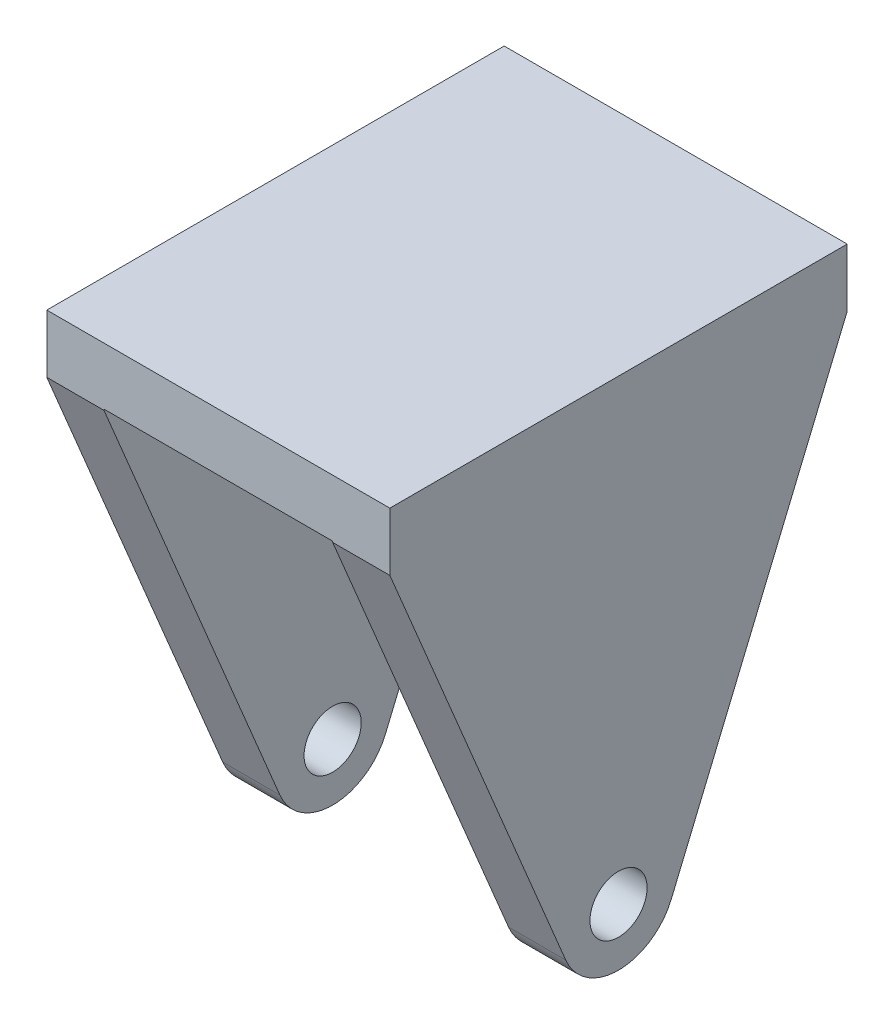
ISO-10303-21;
HEADER;
FILE_DESCRIPTION(('STEP AP214'),'2;1');
FILE_NAME('part.step','',(''),(''),'','','');
FILE_SCHEMA(('AUTOMOTIVE_DESIGN { 1 0 10303 214 1 1 1 1 }'));
ENDSEC;
DATA;
#1=APPLICATION_CONTEXT('core data for automotive mechanical design processes');
#2=APPLICATION_PROTOCOL_DEFINITION('international standard','automotive_design',2000,#1);
#3=PRODUCT_CONTEXT('',#1,'mechanical');
#4=PRODUCT('Part','Part','',(#3));
#5=PRODUCT_RELATED_PRODUCT_CATEGORY('part','',(#4));
#6=PRODUCT_DEFINITION_FORMATION('','',#4);
#7=PRODUCT_DEFINITION_CONTEXT('part definition',#1,'design');
#8=PRODUCT_DEFINITION('design','',#6,#7);
#9=PRODUCT_DEFINITION_SHAPE('','',#8);
#10=(LENGTH_UNIT() NAMED_UNIT(*) SI_UNIT(.MILLI.,.METRE.));
#11=(NAMED_UNIT(*) PLANE_ANGLE_UNIT() SI_UNIT($,.RADIAN.));
#12=(NAMED_UNIT(*) SI_UNIT($,.STERADIAN.) SOLID_ANGLE_UNIT());
#13=UNCERTAINTY_MEASURE_WITH_UNIT(LENGTH_MEASURE(1.E-05),#10,'distance_accuracy_value','');
#14=(GEOMETRIC_REPRESENTATION_CONTEXT(3) GLOBAL_UNCERTAINTY_ASSIGNED_CONTEXT((#13)) GLOBAL_UNIT_ASSIGNED_CONTEXT((#10,
#11,#12)) REPRESENTATION_CONTEXT('',''));
#15=CARTESIAN_POINT('',(0.,0.,0.));
#16=DIRECTION('',(0.,0.,1.));
#17=DIRECTION('',(1.,0.,0.));
#18=AXIS2_PLACEMENT_3D('',#15,#16,#17);
#19=CARTESIAN_POINT('',(52.4580833395359,-3.175,-50.8));
#20=DIRECTION('',(1.,0.,0.));
#21=DIRECTION('',(0.,1.,0.));
#22=AXIS2_PLACEMENT_3D('',#19,#20,#21);
#23=PLANE('',#22);
#24=DIRECTION('',(0.,0.922729860152151,-0.385447279382787));
#25=VECTOR('',#24,1.);
#26=CARTESIAN_POINT('',(52.4580833395359,-19.5004930045681,-46.6826156142968));
#27=LINE('',#26,#25);
#28=CARTESIAN_POINT('',(52.4580833395359,-56.4225902240807,-31.2593346119661));
#29=VERTEX_POINT('',#28);
#30=CARTESIAN_POINT('',(52.4580833395359,-9.64380514703224,-50.8));
#31=VERTEX_POINT('',#30);
#32=EDGE_CURVE('E157',#29,#31,#27,.T.);
#33=ORIENTED_EDGE('',*,*,#32,.T.);
#34=DIRECTION('',(0.,1.,0.));
#35=VECTOR('',#34,1.);
#36=CARTESIAN_POINT('',(52.4580833395359,-3.175,-50.8));
#37=LINE('',#36,#35);
#38=CARTESIAN_POINT('',(52.4580833395359,-3.175,-50.8));
#39=VERTEX_POINT('',#38);
#40=EDGE_CURVE('E170',#31,#39,#37,.T.);
#41=ORIENTED_EDGE('',*,*,#40,.T.);
#42=DIRECTION('',(0.,0.,1.));
#43=VECTOR('',#42,1.);
#44=CARTESIAN_POINT('',(52.4580833395359,-3.175,-50.8));
#45=LINE('',#44,#43);
#46=CARTESIAN_POINT('',(52.4580833395359,-3.175,0.));
#47=VERTEX_POINT('',#46);
#48=EDGE_CURVE('E207',#39,#47,#45,.T.);
#49=ORIENTED_EDGE('',*,*,#48,.T.);
#50=DIRECTION('',(0.,1.,0.));
#51=VECTOR('',#50,1.);
#52=CARTESIAN_POINT('',(52.4580833395359,-3.175,0.));
#53=LINE('',#52,#51);
#54=CARTESIAN_POINT('',(52.4580833395359,-9.64380514703223,0.));
#55=VERTEX_POINT('',#54);
#56=EDGE_CURVE('E205',#55,#47,#53,.T.);
#57=ORIENTED_EDGE('',*,*,#56,.F.);
#58=DIRECTION('',(0.,0.922729860152151,0.385447279382787));
#59=VECTOR('',#58,1.);
#60=CARTESIAN_POINT('',(52.4580833395359,-1.43277632316209,3.42995155762329));
#61=LINE('',#60,#59);
#62=CARTESIAN_POINT('',(52.4580833395359,-56.4225902240807,-19.5406653880338));
#63=VERTEX_POINT('',#62);
#64=EDGE_CURVE('E78',#63,#55,#61,.T.);
#65=ORIENTED_EDGE('',*,*,#64,.F.);
#66=CARTESIAN_POINT('',(52.4580833395359,-53.975,-25.4));
#67=DIRECTION('',(1.,0.,0.));
#68=DIRECTION('',(0.,1.,0.));
#69=AXIS2_PLACEMENT_3D('',#66,#67,#68);
#70=CIRCLE('',#69,6.35);
#71=EDGE_CURVE('E172',#29,#63,#70,.F.);
#72=ORIENTED_EDGE('',*,*,#71,.F.);
#73=EDGE_LOOP('',(#33,#41,#49,#57,#65,#72));
#74=FACE_BOUND('',#73,.T.);
#75=CARTESIAN_POINT('',(52.4580833395359,-53.975,-25.4));
#76=DIRECTION('',(1.,0.,0.));
#77=DIRECTION('',(0.,1.,0.));
#78=AXIS2_PLACEMENT_3D('',#75,#76,#77);
#79=CIRCLE('',#78,3.175);
#80=CARTESIAN_POINT('',(52.4580833395359,-50.8,-25.4));
#81=VERTEX_POINT('',#80);
#82=EDGE_CURVE('E278',#81,#81,#79,.F.);
#83=ORIENTED_EDGE('',*,*,#82,.T.);
#84=EDGE_LOOP('',(#83));
#85=FACE_BOUND('',#84,.T.);
#86=ADVANCED_FACE('F63',(#74,#85),#23,.T.);
#87=CARTESIAN_POINT('',(46.1080833395359,-60.325,-50.8));
#88=DIRECTION('',(-1.,0.,0.));
#89=DIRECTION('',(0.,0.,1.));
#90=AXIS2_PLACEMENT_3D('',#87,#88,#89);
#91=PLANE('',#90);
#92=DIRECTION('',(0.,0.922729860152151,-0.385447279382787));
#93=VECTOR('',#92,1.);
#94=CARTESIAN_POINT('',(46.1080833395359,-52.7953148904619,-32.7745379984536));
#95=LINE('',#94,#93);
#96=CARTESIAN_POINT('',(46.1080833395359,-56.4225902240807,-31.2593346119661));
#97=VERTEX_POINT('',#96);
#98=CARTESIAN_POINT('',(46.1080833395359,-9.64380514703224,-50.8));
#99=VERTEX_POINT('',#98);
#100=EDGE_CURVE('E160',#97,#99,#95,.T.);
#101=ORIENTED_EDGE('',*,*,#100,.F.);
#102=CARTESIAN_POINT('',(46.1080833395359,-53.975,-25.4));
#103=DIRECTION('',(-1.,0.,0.));
#104=DIRECTION('',(0.,0.,1.));
#105=AXIS2_PLACEMENT_3D('',#102,#103,#104);
#106=CIRCLE('',#105,6.35);
#107=CARTESIAN_POINT('',(46.1080833395359,-56.4225902240807,-19.5406653880338));
#108=VERTEX_POINT('',#107);
#109=EDGE_CURVE('E194',#97,#108,#106,.T.);
#110=ORIENTED_EDGE('',*,*,#109,.T.);
#111=DIRECTION('',(0.,0.922729860152151,0.385447279382787));
#112=VECTOR('',#111,1.);
#113=CARTESIAN_POINT('',(46.1080833395359,-70.8630315718679,-25.5727979448728));
#114=LINE('',#113,#112);
#115=CARTESIAN_POINT('',(46.1080833395359,-9.64380514703223,0.));
#116=VERTEX_POINT('',#115);
#117=EDGE_CURVE('E251',#108,#116,#114,.T.);
#118=ORIENTED_EDGE('',*,*,#117,.T.);
#119=DIRECTION('',(0.,-1.,0.));
#120=VECTOR('',#119,1.);
#121=CARTESIAN_POINT('',(46.1080833395359,-60.325,0.));
#122=LINE('',#121,#120);
#123=CARTESIAN_POINT('',(46.1080833395359,-9.525,0.));
#124=VERTEX_POINT('',#123);
#125=EDGE_CURVE('E202',#124,#116,#122,.T.);
#126=ORIENTED_EDGE('',*,*,#125,.F.);
#127=DIRECTION('',(0.,0.,1.));
#128=VECTOR('',#127,1.);
#129=CARTESIAN_POINT('',(46.1080833395359,-9.525,-50.8));
#130=LINE('',#129,#128);
#131=CARTESIAN_POINT('',(46.1080833395359,-9.525,-50.8));
#132=VERTEX_POINT('',#131);
#133=EDGE_CURVE('E209',#132,#124,#130,.T.);
#134=ORIENTED_EDGE('',*,*,#133,.F.);
#135=DIRECTION('',(0.,-1.,0.));
#136=VECTOR('',#135,1.);
#137=CARTESIAN_POINT('',(46.1080833395359,-60.325,-50.8));
#138=LINE('',#137,#136);
#139=EDGE_CURVE('E182',#132,#99,#138,.T.);
#140=ORIENTED_EDGE('',*,*,#139,.T.);
#141=EDGE_LOOP('',(#101,#110,#118,#126,#134,#140));
#142=FACE_BOUND('',#141,.T.);
#143=CARTESIAN_POINT('',(46.1080833395359,-53.975,-25.4));
#144=DIRECTION('',(-1.,0.,0.));
#145=DIRECTION('',(0.,0.,1.));
#146=AXIS2_PLACEMENT_3D('',#143,#144,#145);
#147=CIRCLE('',#146,3.175);
#148=CARTESIAN_POINT('',(46.1080833395359,-53.975,-22.225));
#149=VERTEX_POINT('',#148);
#150=EDGE_CURVE('E286',#149,#149,#147,.T.);
#151=ORIENTED_EDGE('',*,*,#150,.F.);
#152=EDGE_LOOP('',(#151));
#153=FACE_BOUND('',#152,.T.);
#154=ADVANCED_FACE('F247',(#142,#153),#91,.T.);
#155=CARTESIAN_POINT('',(20.7080833395359,-9.525,-50.8));
#156=DIRECTION('',(1.,0.,0.));
#157=DIRECTION('',(0.,1.,0.));
#158=AXIS2_PLACEMENT_3D('',#155,#156,#157);
#159=PLANE('',#158);
#160=DIRECTION('',(0.,-0.922729860152151,0.385447279382787));
#161=VECTOR('',#160,1.);
#162=CARTESIAN_POINT('',(20.7080833395359,-9.54265083378836,-50.8422546798597));
#163=LINE('',#162,#161);
#164=CARTESIAN_POINT('',(20.7080833395359,-9.64380514703223,-50.8));
#165=VERTEX_POINT('',#164);
#166=CARTESIAN_POINT('',(20.7080833395359,-56.4225902240807,-31.2593346119661));
#167=VERTEX_POINT('',#166);
#168=EDGE_CURVE('E257',#165,#167,#163,.T.);
#169=ORIENTED_EDGE('',*,*,#168,.F.);
#170=DIRECTION('',(0.,1.,0.));
#171=VECTOR('',#170,1.);
#172=CARTESIAN_POINT('',(20.7080833395359,-9.525,-50.8));
#173=LINE('',#172,#171);
#174=CARTESIAN_POINT('',(20.7080833395359,-9.525,-50.8));
#175=VERTEX_POINT('',#174);
#176=EDGE_CURVE('E234',#165,#175,#173,.T.);
#177=ORIENTED_EDGE('',*,*,#176,.T.);
#178=DIRECTION('',(0.,0.,1.));
#179=VECTOR('',#178,1.);
#180=CARTESIAN_POINT('',(20.7080833395359,-9.525,-50.8));
#181=LINE('',#180,#179);
#182=CARTESIAN_POINT('',(20.7080833395359,-9.525,0.));
#183=VERTEX_POINT('',#182);
#184=EDGE_CURVE('E184',#175,#183,#181,.T.);
#185=ORIENTED_EDGE('',*,*,#184,.T.);
#186=DIRECTION('',(0.,1.,0.));
#187=VECTOR('',#186,1.);
#188=CARTESIAN_POINT('',(20.7080833395359,-9.525,0.));
#189=LINE('',#188,#187);
#190=CARTESIAN_POINT('',(20.7080833395359,-9.64380514703223,0.));
#191=VERTEX_POINT('',#190);
#192=EDGE_CURVE('E197',#191,#183,#189,.T.);
#193=ORIENTED_EDGE('',*,*,#192,.F.);
#194=DIRECTION('',(0.,-0.922729860152151,-0.385447279382787));
#195=VECTOR('',#194,1.);
#196=CARTESIAN_POINT('',(20.7080833395359,-27.6103675151944,-7.50508126346681));
#197=LINE('',#196,#195);
#198=CARTESIAN_POINT('',(20.7080833395359,-56.4225902240807,-19.5406653880338));
#199=VERTEX_POINT('',#198);
#200=EDGE_CURVE('E86',#191,#199,#197,.T.);
#201=ORIENTED_EDGE('',*,*,#200,.T.);
#202=CARTESIAN_POINT('',(20.7080833395359,-53.975,-25.4));
#203=DIRECTION('',(1.,0.,0.));
#204=DIRECTION('',(0.,1.,0.));
#205=AXIS2_PLACEMENT_3D('',#202,#203,#204);
#206=CIRCLE('',#205,6.35);
#207=EDGE_CURVE('E258',#199,#167,#206,.T.);
#208=ORIENTED_EDGE('',*,*,#207,.T.);
#209=EDGE_LOOP('',(#169,#177,#185,#193,#201,#208));
#210=FACE_BOUND('',#209,.T.);
#211=CARTESIAN_POINT('',(20.7080833395359,-53.975,-25.4));
#212=DIRECTION('',(1.,0.,0.));
#213=DIRECTION('',(0.,1.,0.));
#214=AXIS2_PLACEMENT_3D('',#211,#212,#213);
#215=CIRCLE('',#214,3.175);
#216=CARTESIAN_POINT('',(20.7080833395359,-50.8,-25.4));
#217=VERTEX_POINT('',#216);
#218=EDGE_CURVE('E283',#217,#217,#215,.T.);
#219=ORIENTED_EDGE('',*,*,#218,.F.);
#220=EDGE_LOOP('',(#219));
#221=FACE_BOUND('',#220,.T.);
#222=ADVANCED_FACE('F254',(#210,#221),#159,.T.);
#223=CARTESIAN_POINT('',(14.3580833395359,-60.325,-50.8));
#224=DIRECTION('',(-1.,0.,0.));
#225=DIRECTION('',(0.,-1.,0.));
#226=AXIS2_PLACEMENT_3D('',#223,#224,#225);
#227=PLANE('',#226);
#228=DIRECTION('',(0.,0.922729860152151,-0.385447279382787));
#229=VECTOR('',#228,1.);
#230=CARTESIAN_POINT('',(14.3580833395359,-19.5004930045681,-46.6826156142968));
#231=LINE('',#230,#229);
#232=CARTESIAN_POINT('',(14.3580833395359,-56.4225902240807,-31.2593346119661));
#233=VERTEX_POINT('',#232);
#234=CARTESIAN_POINT('',(14.3580833395359,-9.64380514703223,-50.8));
#235=VERTEX_POINT('',#234);
#236=EDGE_CURVE('E173',#233,#235,#231,.T.);
#237=ORIENTED_EDGE('',*,*,#236,.F.);
#238=CARTESIAN_POINT('',(14.3580833395359,-53.975,-25.4));
#239=DIRECTION('',(-1.,0.,0.));
#240=DIRECTION('',(0.,-1.,0.));
#241=AXIS2_PLACEMENT_3D('',#238,#239,#240);
#242=CIRCLE('',#241,6.35);
#243=CARTESIAN_POINT('',(14.3580833395359,-56.4225902240807,-19.5406653880338));
#244=VERTEX_POINT('',#243);
#245=EDGE_CURVE('E224',#233,#244,#242,.T.);
#246=ORIENTED_EDGE('',*,*,#245,.T.);
#247=DIRECTION('',(0.,0.922729860152151,0.385447279382787));
#248=VECTOR('',#247,1.);
#249=CARTESIAN_POINT('',(14.3580833395359,-1.43277632316207,3.42995155762329));
#250=LINE('',#249,#248);
#251=CARTESIAN_POINT('',(14.3580833395359,-9.64380514703222,0.));
#252=VERTEX_POINT('',#251);
#253=EDGE_CURVE('E215',#244,#252,#250,.T.);
#254=ORIENTED_EDGE('',*,*,#253,.T.);
#255=DIRECTION('',(0.,-1.,0.));
#256=VECTOR('',#255,1.);
#257=CARTESIAN_POINT('',(14.3580833395359,-60.325,0.));
#258=LINE('',#257,#256);
#259=CARTESIAN_POINT('',(14.3580833395359,-3.175,0.));
#260=VERTEX_POINT('',#259);
#261=EDGE_CURVE('E193',#260,#252,#258,.T.);
#262=ORIENTED_EDGE('',*,*,#261,.F.);
#263=DIRECTION('',(0.,0.,1.));
#264=VECTOR('',#263,1.);
#265=CARTESIAN_POINT('',(14.3580833395359,-3.175,-50.8));
#266=LINE('',#265,#264);
#267=CARTESIAN_POINT('',(14.3580833395359,-3.175,-50.8));
#268=VERTEX_POINT('',#267);
#269=EDGE_CURVE('E181',#268,#260,#266,.T.);
#270=ORIENTED_EDGE('',*,*,#269,.F.);
#271=DIRECTION('',(0.,-1.,0.));
#272=VECTOR('',#271,1.);
#273=CARTESIAN_POINT('',(14.3580833395359,-60.325,-50.8));
#274=LINE('',#273,#272);
#275=EDGE_CURVE('E232',#268,#235,#274,.T.);
#276=ORIENTED_EDGE('',*,*,#275,.T.);
#277=EDGE_LOOP('',(#237,#246,#254,#262,#270,#276));
#278=FACE_BOUND('',#277,.T.);
#279=CARTESIAN_POINT('',(14.3580833395359,-53.975,-25.4));
#280=DIRECTION('',(-1.,0.,0.));
#281=DIRECTION('',(0.,-1.,0.));
#282=AXIS2_PLACEMENT_3D('',#279,#280,#281);
#283=CIRCLE('',#282,3.175);
#284=CARTESIAN_POINT('',(14.3580833395359,-57.15,-25.4));
#285=VERTEX_POINT('',#284);
#286=EDGE_CURVE('E268',#285,#285,#283,.T.);
#287=ORIENTED_EDGE('',*,*,#286,.F.);
#288=EDGE_LOOP('',(#287));
#289=FACE_BOUND('',#288,.T.);
#290=ADVANCED_FACE('F222',(#278,#289),#227,.T.);
#291=CARTESIAN_POINT('',(0.,0.,0.));
#292=DIRECTION('',(0.,0.,-1.));
#293=DIRECTION('',(-1.,0.,0.));
#294=AXIS2_PLACEMENT_3D('',#291,#292,#293);
#295=PLANE('',#294);
#296=DIRECTION('',(-1.,0.,0.));
#297=VECTOR('',#296,1.);
#298=CARTESIAN_POINT('',(109.147972312125,-9.64380514703224,0.));
#299=LINE('',#298,#297);
#300=EDGE_CURVE('E271',#55,#116,#299,.T.);
#301=ORIENTED_EDGE('',*,*,#300,.F.);
#302=ORIENTED_EDGE('',*,*,#56,.T.);
#303=DIRECTION('',(-1.,0.,0.));
#304=VECTOR('',#303,1.);
#305=CARTESIAN_POINT('',(14.3580833395359,-3.175,0.));
#306=LINE('',#305,#304);
#307=EDGE_CURVE('E190',#47,#260,#306,.T.);
#308=ORIENTED_EDGE('',*,*,#307,.T.);
#309=ORIENTED_EDGE('',*,*,#261,.T.);
#310=DIRECTION('',(-1.,0.,0.));
#311=VECTOR('',#310,1.);
#312=CARTESIAN_POINT('',(0.,-9.64380514703222,0.));
#313=LINE('',#312,#311);
#314=EDGE_CURVE('E71',#191,#252,#313,.T.);
#315=ORIENTED_EDGE('',*,*,#314,.F.);
#316=ORIENTED_EDGE('',*,*,#192,.T.);
#317=DIRECTION('',(1.,0.,0.));
#318=VECTOR('',#317,1.);
#319=CARTESIAN_POINT('',(46.1080833395359,-9.525,0.));
#320=LINE('',#319,#318);
#321=EDGE_CURVE('E199',#183,#124,#320,.T.);
#322=ORIENTED_EDGE('',*,*,#321,.T.);
#323=ORIENTED_EDGE('',*,*,#125,.T.);
#324=EDGE_LOOP('',(#301,#302,#308,#309,#315,#316,#322,#323));
#325=FACE_BOUND('',#324,.T.);
#326=ADVANCED_FACE('F227',(#325),#295,.F.);
#327=CARTESIAN_POINT('',(14.3580833395359,-3.175,-50.8));
#328=DIRECTION('',(0.,1.,0.));
#329=DIRECTION('',(0.,0.,1.));
#330=AXIS2_PLACEMENT_3D('',#327,#328,#329);
#331=PLANE('',#330);
#332=ORIENTED_EDGE('',*,*,#307,.F.);
#333=ORIENTED_EDGE('',*,*,#48,.F.);
#334=DIRECTION('',(-1.,0.,0.));
#335=VECTOR('',#334,1.);
#336=CARTESIAN_POINT('',(14.3580833395359,-3.175,-50.8));
#337=LINE('',#336,#335);
#338=EDGE_CURVE('E180',#39,#268,#337,.T.);
#339=ORIENTED_EDGE('',*,*,#338,.T.);
#340=ORIENTED_EDGE('',*,*,#269,.T.);
#341=EDGE_LOOP('',(#332,#333,#339,#340));
#342=FACE_BOUND('',#341,.T.);
#343=ADVANCED_FACE('F65',(#342),#331,.T.);
#344=CARTESIAN_POINT('',(46.1080833395359,-9.525,-50.8));
#345=DIRECTION('',(0.,-1.,0.));
#346=DIRECTION('',(1.,0.,0.));
#347=AXIS2_PLACEMENT_3D('',#344,#345,#346);
#348=PLANE('',#347);
#349=ORIENTED_EDGE('',*,*,#321,.F.);
#350=ORIENTED_EDGE('',*,*,#184,.F.);
#351=DIRECTION('',(1.,0.,0.));
#352=VECTOR('',#351,1.);
#353=CARTESIAN_POINT('',(46.1080833395359,-9.525,-50.8));
#354=LINE('',#353,#352);
#355=EDGE_CURVE('E186',#175,#132,#354,.T.);
#356=ORIENTED_EDGE('',*,*,#355,.T.);
#357=ORIENTED_EDGE('',*,*,#133,.T.);
#358=EDGE_LOOP('',(#349,#350,#356,#357));
#359=FACE_BOUND('',#358,.T.);
#360=ADVANCED_FACE('F244',(#359),#348,.T.);
#361=CARTESIAN_POINT('',(0.,0.,-50.8));
#362=DIRECTION('',(0.,0.,-1.));
#363=DIRECTION('',(-1.,0.,0.));
#364=AXIS2_PLACEMENT_3D('',#361,#362,#363);
#365=PLANE('',#364);
#366=DIRECTION('',(1.,0.,0.));
#367=VECTOR('',#366,1.);
#368=CARTESIAN_POINT('',(0.,-9.64380514703222,-50.8));
#369=LINE('',#368,#367);
#370=EDGE_CURVE('E12',#235,#165,#369,.T.);
#371=ORIENTED_EDGE('',*,*,#370,.F.);
#372=ORIENTED_EDGE('',*,*,#275,.F.);
#373=ORIENTED_EDGE('',*,*,#338,.F.);
#374=ORIENTED_EDGE('',*,*,#40,.F.);
#375=DIRECTION('',(-1.,0.,0.));
#376=VECTOR('',#375,1.);
#377=CARTESIAN_POINT('',(109.147972312125,-9.64380514703224,-50.8));
#378=LINE('',#377,#376);
#379=EDGE_CURVE('E153',#31,#99,#378,.T.);
#380=ORIENTED_EDGE('',*,*,#379,.T.);
#381=ORIENTED_EDGE('',*,*,#139,.F.);
#382=ORIENTED_EDGE('',*,*,#355,.F.);
#383=ORIENTED_EDGE('',*,*,#176,.F.);
#384=EDGE_LOOP('',(#371,#372,#373,#374,#380,#381,#382,#383));
#385=FACE_BOUND('',#384,.T.);
#386=ADVANCED_FACE('F177',(#385),#365,.T.);
#387=CARTESIAN_POINT('',(109.147972312125,-1.43277632316208,3.42995155762329));
#388=DIRECTION('',(0.,-0.385447279382787,0.922729860152151));
#389=DIRECTION('',(0.,-0.922729860152151,-0.385447279382787));
#390=AXIS2_PLACEMENT_3D('',#387,#388,#389);
#391=PLANE('',#390);
#392=ORIENTED_EDGE('',*,*,#314,.T.);
#393=ORIENTED_EDGE('',*,*,#253,.F.);
#394=DIRECTION('',(-1.,0.,0.));
#395=VECTOR('',#394,1.);
#396=CARTESIAN_POINT('',(109.147972312125,-56.4225902240807,-19.5406653880338));
#397=LINE('',#396,#395);
#398=EDGE_CURVE('E274',#199,#244,#397,.T.);
#399=ORIENTED_EDGE('',*,*,#398,.F.);
#400=ORIENTED_EDGE('',*,*,#200,.F.);
#401=EDGE_LOOP('',(#392,#393,#399,#400));
#402=FACE_BOUND('',#401,.T.);
#403=ADVANCED_FACE('F214',(#402),#391,.T.);
#404=CARTESIAN_POINT('',(109.147972312125,-53.975,-25.4));
#405=DIRECTION('',(-1.,0.,0.));
#406=DIRECTION('',(0.,-1.,0.));
#407=AXIS2_PLACEMENT_3D('',#404,#405,#406);
#408=CYLINDRICAL_SURFACE('',#407,6.35);
#409=ORIENTED_EDGE('',*,*,#398,.T.);
#410=ORIENTED_EDGE('',*,*,#245,.F.);
#411=DIRECTION('',(-1.,0.,0.));
#412=VECTOR('',#411,1.);
#413=CARTESIAN_POINT('',(109.147972312125,-56.4225902240807,-31.2593346119661));
#414=LINE('',#413,#412);
#415=EDGE_CURVE('E165',#167,#233,#414,.T.);
#416=ORIENTED_EDGE('',*,*,#415,.F.);
#417=ORIENTED_EDGE('',*,*,#207,.F.);
#418=EDGE_LOOP('',(#409,#410,#416,#417));
#419=FACE_BOUND('',#418,.T.);
#420=ADVANCED_FACE('F302',(#419),#408,.T.);
#421=ORIENTED_EDGE('',*,*,#109,.F.);
#422=EDGE_CURVE('E262',#29,#97,#414,.T.);
#423=ORIENTED_EDGE('',*,*,#422,.F.);
#424=ORIENTED_EDGE('',*,*,#71,.T.);
#425=EDGE_CURVE('E225',#63,#108,#397,.T.);
#426=ORIENTED_EDGE('',*,*,#425,.T.);
#427=EDGE_LOOP('',(#421,#423,#424,#426));
#428=FACE_BOUND('',#427,.T.);
#429=ADVANCED_FACE('F290',(#428),#408,.T.);
#430=ORIENTED_EDGE('',*,*,#425,.F.);
#431=ORIENTED_EDGE('',*,*,#64,.T.);
#432=ORIENTED_EDGE('',*,*,#300,.T.);
#433=ORIENTED_EDGE('',*,*,#117,.F.);
#434=EDGE_LOOP('',(#430,#431,#432,#433));
#435=FACE_BOUND('',#434,.T.);
#436=ADVANCED_FACE('F291',(#435),#391,.T.);
#437=CARTESIAN_POINT('',(109.147972312125,-53.975,-25.4));
#438=DIRECTION('',(-1.,0.,0.));
#439=DIRECTION('',(0.,-1.,0.));
#440=AXIS2_PLACEMENT_3D('',#437,#438,#439);
#441=CYLINDRICAL_SURFACE('',#440,3.175);
#442=ORIENTED_EDGE('',*,*,#218,.T.);
#443=EDGE_LOOP('',(#442));
#444=FACE_BOUND('',#443,.T.);
#445=ORIENTED_EDGE('',*,*,#286,.T.);
#446=EDGE_LOOP('',(#445));
#447=FACE_BOUND('',#446,.T.);
#448=ADVANCED_FACE('F293',(#444,#447),#441,.F.);
#449=ORIENTED_EDGE('',*,*,#150,.T.);
#450=EDGE_LOOP('',(#449));
#451=FACE_BOUND('',#450,.T.);
#452=ORIENTED_EDGE('',*,*,#82,.F.);
#453=EDGE_LOOP('',(#452));
#454=FACE_BOUND('',#453,.T.);
#455=ADVANCED_FACE('F299',(#451,#454),#441,.F.);
#456=CARTESIAN_POINT('',(109.147972312125,-19.5004930045681,-46.6826156142968));
#457=DIRECTION('',(0.,0.385447279382787,0.922729860152151));
#458=DIRECTION('',(0.,-0.922729860152151,0.385447279382787));
#459=AXIS2_PLACEMENT_3D('',#456,#457,#458);
#460=PLANE('',#459);
#461=ORIENTED_EDGE('',*,*,#100,.T.);
#462=ORIENTED_EDGE('',*,*,#379,.F.);
#463=ORIENTED_EDGE('',*,*,#32,.F.);
#464=ORIENTED_EDGE('',*,*,#422,.T.);
#465=EDGE_LOOP('',(#461,#462,#463,#464));
#466=FACE_BOUND('',#465,.T.);
#467=ADVANCED_FACE('F155',(#466),#460,.F.);
#468=ORIENTED_EDGE('',*,*,#168,.T.);
#469=ORIENTED_EDGE('',*,*,#415,.T.);
#470=ORIENTED_EDGE('',*,*,#236,.T.);
#471=ORIENTED_EDGE('',*,*,#370,.T.);
#472=EDGE_LOOP('',(#468,#469,#470,#471));
#473=FACE_BOUND('',#472,.T.);
#474=ADVANCED_FACE('F377',(#473),#460,.F.);
#475=CLOSED_SHELL('',(#86,#154,#222,#290,#326,#343,#360,#386,#403,#420,#429,#436,#448,#455,#467,#474));
#476=MANIFOLD_SOLID_BREP('B2',#475);
#477=ADVANCED_BREP_SHAPE_REPRESENTATION('',(#18,#476),#14);
#478=SHAPE_DEFINITION_REPRESENTATION(#9,#477);
ENDSEC;
END-ISO-10303-21;
